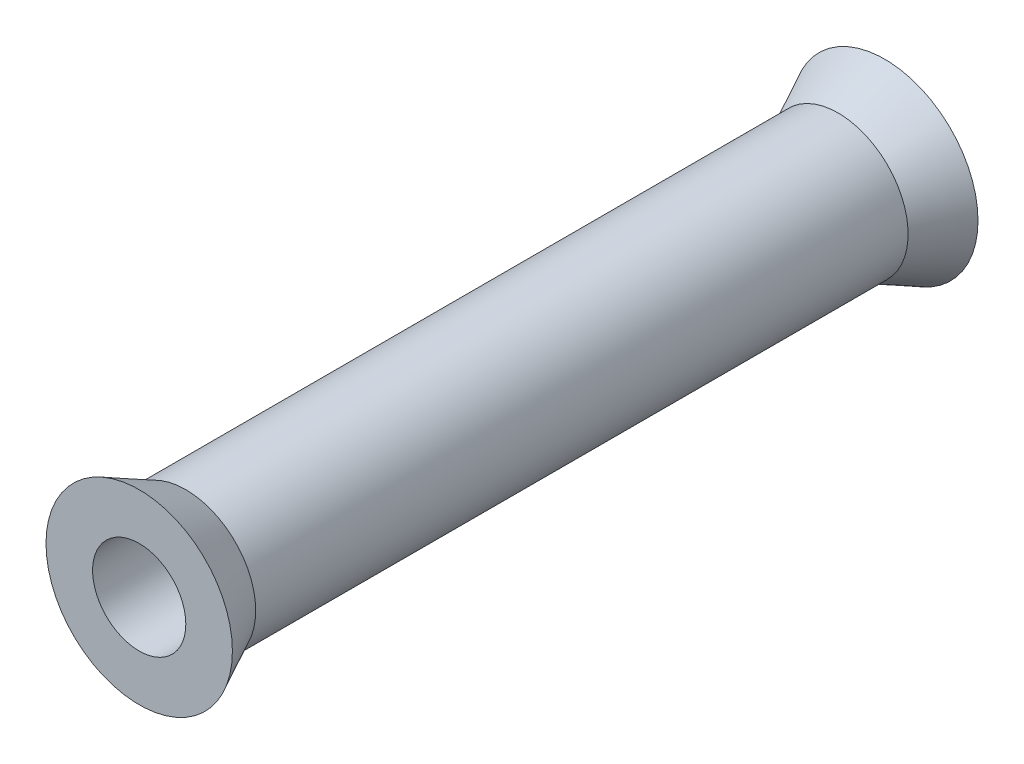
ISO-10303-21;
HEADER;
FILE_DESCRIPTION(('STEP AP214'),'2;1');
FILE_NAME('part.step','',(''),(''),'','','');
FILE_SCHEMA(('AUTOMOTIVE_DESIGN { 1 0 10303 214 1 1 1 1 }'));
ENDSEC;
DATA;
#1=APPLICATION_CONTEXT('core data for automotive mechanical design processes');
#2=APPLICATION_PROTOCOL_DEFINITION('international standard','automotive_design',2000,#1);
#3=PRODUCT_CONTEXT('',#1,'mechanical');
#4=PRODUCT('Part','Part','',(#3));
#5=PRODUCT_RELATED_PRODUCT_CATEGORY('part','',(#4));
#6=PRODUCT_DEFINITION_FORMATION('','',#4);
#7=PRODUCT_DEFINITION_CONTEXT('part definition',#1,'design');
#8=PRODUCT_DEFINITION('design','',#6,#7);
#9=PRODUCT_DEFINITION_SHAPE('','',#8);
#10=(LENGTH_UNIT() NAMED_UNIT(*) SI_UNIT(.MILLI.,.METRE.));
#11=(NAMED_UNIT(*) PLANE_ANGLE_UNIT() SI_UNIT($,.RADIAN.));
#12=(NAMED_UNIT(*) SI_UNIT($,.STERADIAN.) SOLID_ANGLE_UNIT());
#13=UNCERTAINTY_MEASURE_WITH_UNIT(LENGTH_MEASURE(1.E-05),#10,'distance_accuracy_value','');
#14=(GEOMETRIC_REPRESENTATION_CONTEXT(3) GLOBAL_UNCERTAINTY_ASSIGNED_CONTEXT((#13)) GLOBAL_UNIT_ASSIGNED_CONTEXT((#10,
#11,#12)) REPRESENTATION_CONTEXT('',''));
#15=CARTESIAN_POINT('',(0.,0.,0.));
#16=DIRECTION('',(0.,0.,1.));
#17=DIRECTION('',(1.,0.,0.));
#18=AXIS2_PLACEMENT_3D('',#15,#16,#17);
#19=CARTESIAN_POINT('',(0.,0.,25.4));
#20=DIRECTION('',(0.,0.,1.));
#21=DIRECTION('',(1.,0.,0.));
#22=AXIS2_PLACEMENT_3D('',#19,#20,#21);
#23=PLANE('',#22);
#24=CARTESIAN_POINT('',(0.,0.,25.4));
#25=DIRECTION('',(0.,0.,1.));
#26=DIRECTION('',(1.,0.,0.));
#27=AXIS2_PLACEMENT_3D('',#24,#25,#26);
#28=CIRCLE('',#27,6.35);
#29=CARTESIAN_POINT('',(6.35,0.,25.4));
#30=VERTEX_POINT('',#29);
#31=EDGE_CURVE('E48',#30,#30,#28,.T.);
#32=ORIENTED_EDGE('',*,*,#31,.T.);
#33=EDGE_LOOP('',(#32));
#34=FACE_BOUND('',#33,.T.);
#35=CARTESIAN_POINT('',(0.,0.,25.4));
#36=DIRECTION('',(0.,0.,1.));
#37=DIRECTION('',(1.,0.,0.));
#38=AXIS2_PLACEMENT_3D('',#35,#36,#37);
#39=CIRCLE('',#38,3.175);
#40=CARTESIAN_POINT('',(3.175,0.,25.4));
#41=VERTEX_POINT('',#40);
#42=EDGE_CURVE('E10',#41,#41,#39,.T.);
#43=ORIENTED_EDGE('',*,*,#42,.F.);
#44=EDGE_LOOP('',(#43));
#45=FACE_BOUND('',#44,.T.);
#46=ADVANCED_FACE('F33',(#34,#45),#23,.T.);
#47=CARTESIAN_POINT('',(0.,0.,-25.4));
#48=DIRECTION('',(0.,0.,1.));
#49=DIRECTION('',(1.,0.,0.));
#50=AXIS2_PLACEMENT_3D('',#47,#48,#49);
#51=PLANE('',#50);
#52=CARTESIAN_POINT('',(0.,0.,-25.4));
#53=DIRECTION('',(0.,0.,-1.));
#54=DIRECTION('',(-1.,0.,0.));
#55=AXIS2_PLACEMENT_3D('',#52,#53,#54);
#56=CIRCLE('',#55,6.35);
#57=CARTESIAN_POINT('',(-6.35,0.,-25.4));
#58=VERTEX_POINT('',#57);
#59=EDGE_CURVE('E44',#58,#58,#56,.T.);
#60=ORIENTED_EDGE('',*,*,#59,.T.);
#61=EDGE_LOOP('',(#60));
#62=FACE_BOUND('',#61,.T.);
#63=CARTESIAN_POINT('',(0.,0.,-25.4));
#64=DIRECTION('',(0.,0.,1.));
#65=DIRECTION('',(1.,0.,0.));
#66=AXIS2_PLACEMENT_3D('',#63,#64,#65);
#67=CIRCLE('',#66,3.175);
#68=CARTESIAN_POINT('',(3.175,0.,-25.4));
#69=VERTEX_POINT('',#68);
#70=EDGE_CURVE('E37',#69,#69,#67,.T.);
#71=ORIENTED_EDGE('',*,*,#70,.T.);
#72=EDGE_LOOP('',(#71));
#73=FACE_BOUND('',#72,.T.);
#74=ADVANCED_FACE('F35',(#62,#73),#51,.F.);
#75=CARTESIAN_POINT('',(0.,0.,25.4));
#76=DIRECTION('',(0.,0.,-1.));
#77=DIRECTION('',(-1.,0.,0.));
#78=AXIS2_PLACEMENT_3D('',#75,#76,#77);
#79=CYLINDRICAL_SURFACE('',#78,3.175);
#80=ORIENTED_EDGE('',*,*,#42,.T.);
#81=EDGE_LOOP('',(#80));
#82=FACE_BOUND('',#81,.T.);
#83=ORIENTED_EDGE('',*,*,#70,.F.);
#84=EDGE_LOOP('',(#83));
#85=FACE_BOUND('',#84,.T.);
#86=ADVANCED_FACE('F73',(#82,#85),#79,.F.);
#87=CARTESIAN_POINT('',(0.,0.,-22.225));
#88=DIRECTION('',(0.,0.,-1.));
#89=DIRECTION('',(-1.,0.,0.));
#90=AXIS2_PLACEMENT_3D('',#87,#88,#89);
#91=CONICAL_SURFACE('',#90,4.7625,0.463647609000806);
#92=CARTESIAN_POINT('',(0.,0.,-22.225));
#93=DIRECTION('',(0.,0.,-1.));
#94=DIRECTION('',(-1.,0.,0.));
#95=AXIS2_PLACEMENT_3D('',#92,#93,#94);
#96=CIRCLE('',#95,4.7625);
#97=CARTESIAN_POINT('',(-4.7625,0.,-22.225));
#98=VERTEX_POINT('',#97);
#99=EDGE_CURVE('E51',#98,#98,#96,.T.);
#100=ORIENTED_EDGE('',*,*,#99,.T.);
#101=EDGE_LOOP('',(#100));
#102=FACE_BOUND('',#101,.T.);
#103=ORIENTED_EDGE('',*,*,#59,.F.);
#104=EDGE_LOOP('',(#103));
#105=FACE_BOUND('',#104,.T.);
#106=ADVANCED_FACE('F64',(#102,#105),#91,.T.);
#107=CARTESIAN_POINT('',(0.,0.,28.575));
#108=DIRECTION('',(0.,0.,1.));
#109=DIRECTION('',(1.,0.,0.));
#110=AXIS2_PLACEMENT_3D('',#107,#108,#109);
#111=CONICAL_SURFACE('',#110,7.9375,0.463647609000806);
#112=CARTESIAN_POINT('',(0.,0.,22.225));
#113=DIRECTION('',(0.,0.,-1.));
#114=DIRECTION('',(-1.,0.,0.));
#115=AXIS2_PLACEMENT_3D('',#112,#113,#114);
#116=CIRCLE('',#115,4.76249999999999);
#117=CARTESIAN_POINT('',(-4.76249999999999,0.,22.225));
#118=VERTEX_POINT('',#117);
#119=EDGE_CURVE('E54',#118,#118,#116,.T.);
#120=ORIENTED_EDGE('',*,*,#119,.F.);
#121=EDGE_LOOP('',(#120));
#122=FACE_BOUND('',#121,.T.);
#123=ORIENTED_EDGE('',*,*,#31,.F.);
#124=EDGE_LOOP('',(#123));
#125=FACE_BOUND('',#124,.T.);
#126=ADVANCED_FACE('F61',(#122,#125),#111,.T.);
#127=CARTESIAN_POINT('',(0.,0.,0.));
#128=DIRECTION('',(0.,0.,-1.));
#129=DIRECTION('',(-1.,0.,0.));
#130=AXIS2_PLACEMENT_3D('',#127,#128,#129);
#131=CYLINDRICAL_SURFACE('',#130,4.7625);
#132=ORIENTED_EDGE('',*,*,#119,.T.);
#133=EDGE_LOOP('',(#132));
#134=FACE_BOUND('',#133,.T.);
#135=ORIENTED_EDGE('',*,*,#99,.F.);
#136=EDGE_LOOP('',(#135));
#137=FACE_BOUND('',#136,.T.);
#138=ADVANCED_FACE('F58',(#134,#137),#131,.T.);
#139=CLOSED_SHELL('',(#46,#74,#86,#106,#126,#138));
#140=MANIFOLD_SOLID_BREP('B2',#139);
#141=ADVANCED_BREP_SHAPE_REPRESENTATION('',(#18,#140),#14);
#142=SHAPE_DEFINITION_REPRESENTATION(#9,#141);
ENDSEC;
END-ISO-10303-21;
